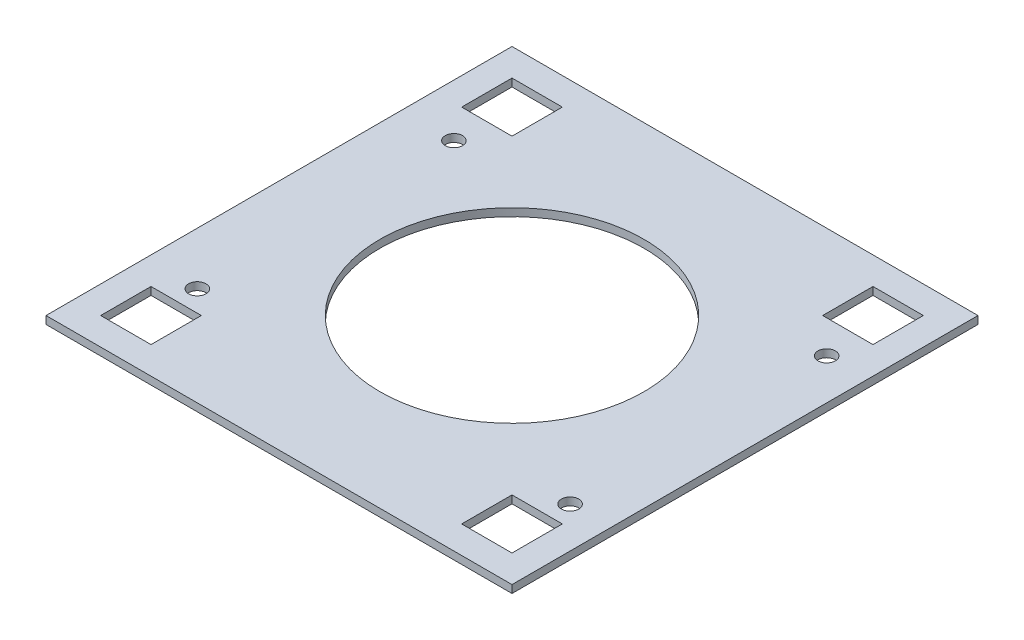
ISO-10303-21;
HEADER;
FILE_DESCRIPTION(('STEP AP214'),'2;1');
FILE_NAME('part.step','',(''),(''),'','','');
FILE_SCHEMA(('AUTOMOTIVE_DESIGN { 1 0 10303 214 1 1 1 1 }'));
ENDSEC;
DATA;
#1=APPLICATION_CONTEXT('core data for automotive mechanical design processes');
#2=APPLICATION_PROTOCOL_DEFINITION('international standard','automotive_design',2000,#1);
#3=PRODUCT_CONTEXT('',#1,'mechanical');
#4=PRODUCT('Part','Part','',(#3));
#5=PRODUCT_RELATED_PRODUCT_CATEGORY('part','',(#4));
#6=PRODUCT_DEFINITION_FORMATION('','',#4);
#7=PRODUCT_DEFINITION_CONTEXT('part definition',#1,'design');
#8=PRODUCT_DEFINITION('design','',#6,#7);
#9=PRODUCT_DEFINITION_SHAPE('','',#8);
#10=(LENGTH_UNIT() NAMED_UNIT(*) SI_UNIT(.MILLI.,.METRE.));
#11=(NAMED_UNIT(*) PLANE_ANGLE_UNIT() SI_UNIT($,.RADIAN.));
#12=(NAMED_UNIT(*) SI_UNIT($,.STERADIAN.) SOLID_ANGLE_UNIT());
#13=UNCERTAINTY_MEASURE_WITH_UNIT(LENGTH_MEASURE(1.E-05),#10,'distance_accuracy_value','');
#14=(GEOMETRIC_REPRESENTATION_CONTEXT(3) GLOBAL_UNCERTAINTY_ASSIGNED_CONTEXT((#13)) GLOBAL_UNIT_ASSIGNED_CONTEXT((#10,
#11,#12)) REPRESENTATION_CONTEXT('',''));
#15=CARTESIAN_POINT('',(0.,0.,0.));
#16=DIRECTION('',(0.,0.,1.));
#17=DIRECTION('',(1.,0.,0.));
#18=AXIS2_PLACEMENT_3D('',#15,#16,#17);
#19=CARTESIAN_POINT('',(0.,6.35,0.));
#20=DIRECTION('',(0.,1.,0.));
#21=DIRECTION('',(0.,0.,1.));
#22=AXIS2_PLACEMENT_3D('',#19,#20,#21);
#23=PLANE('',#22);
#24=CARTESIAN_POINT('',(157.226,6.35,109.728));
#25=DIRECTION('',(0.,1.,0.));
#26=DIRECTION('',(0.,0.,1.));
#27=AXIS2_PLACEMENT_3D('',#24,#25,#26);
#28=CIRCLE('',#27,7.112);
#29=CARTESIAN_POINT('',(157.226,6.35,116.84));
#30=VERTEX_POINT('',#29);
#31=EDGE_CURVE('E495',#30,#30,#28,.T.);
#32=ORIENTED_EDGE('',*,*,#31,.F.);
#33=EDGE_LOOP('',(#32));
#34=FACE_BOUND('',#33,.T.);
#35=CARTESIAN_POINT('',(-147.574,6.35,-100.076));
#36=DIRECTION('',(0.,1.,0.));
#37=DIRECTION('',(0.,0.,1.));
#38=AXIS2_PLACEMENT_3D('',#35,#36,#37);
#39=CIRCLE('',#38,7.112);
#40=CARTESIAN_POINT('',(-147.574,6.35,-92.964));
#41=VERTEX_POINT('',#40);
#42=EDGE_CURVE('E487',#41,#41,#39,.T.);
#43=ORIENTED_EDGE('',*,*,#42,.F.);
#44=EDGE_LOOP('',(#43));
#45=FACE_BOUND('',#44,.T.);
#46=CARTESIAN_POINT('',(-147.574,6.35,109.728));
#47=DIRECTION('',(0.,1.,0.));
#48=DIRECTION('',(0.,0.,1.));
#49=AXIS2_PLACEMENT_3D('',#46,#47,#48);
#50=CIRCLE('',#49,7.11199999999997);
#51=CARTESIAN_POINT('',(-147.574,6.35,116.84));
#52=VERTEX_POINT('',#51);
#53=EDGE_CURVE('E483',#52,#52,#50,.T.);
#54=ORIENTED_EDGE('',*,*,#53,.F.);
#55=EDGE_LOOP('',(#54));
#56=FACE_BOUND('',#55,.T.);
#57=CARTESIAN_POINT('',(157.226,6.35,-100.076));
#58=DIRECTION('',(0.,1.,0.));
#59=DIRECTION('',(0.,0.,1.));
#60=AXIS2_PLACEMENT_3D('',#57,#58,#59);
#61=CIRCLE('',#60,7.112);
#62=CARTESIAN_POINT('',(157.226,6.35,-92.964));
#63=VERTEX_POINT('',#62);
#64=EDGE_CURVE('E204',#63,#63,#61,.T.);
#65=ORIENTED_EDGE('',*,*,#64,.F.);
#66=EDGE_LOOP('',(#65));
#67=FACE_BOUND('',#66,.T.);
#68=DIRECTION('',(-1.,0.,0.));
#69=VECTOR('',#68,1.);
#70=CARTESIAN_POINT('',(0.,6.35,127.));
#71=LINE('',#70,#69);
#72=CARTESIAN_POINT('',(-127.,6.35,127.));
#73=VERTEX_POINT('',#72);
#74=CARTESIAN_POINT('',(-168.148,6.35,127.));
#75=VERTEX_POINT('',#74);
#76=EDGE_CURVE('E52',#73,#75,#71,.T.);
#77=ORIENTED_EDGE('',*,*,#76,.F.);
#78=DIRECTION('',(0.,0.,1.));
#79=VECTOR('',#78,1.);
#80=CARTESIAN_POINT('',(-127.,6.35,0.));
#81=LINE('',#80,#79);
#82=CARTESIAN_POINT('',(-127.,6.35,168.148));
#83=VERTEX_POINT('',#82);
#84=EDGE_CURVE('E254',#73,#83,#81,.T.);
#85=ORIENTED_EDGE('',*,*,#84,.T.);
#86=DIRECTION('',(-1.,0.,0.));
#87=VECTOR('',#86,1.);
#88=CARTESIAN_POINT('',(0.,6.35,168.148));
#89=LINE('',#88,#87);
#90=CARTESIAN_POINT('',(-168.148,6.35,168.148));
#91=VERTEX_POINT('',#90);
#92=EDGE_CURVE('E268',#83,#91,#89,.T.);
#93=ORIENTED_EDGE('',*,*,#92,.T.);
#94=DIRECTION('',(0.,0.,1.));
#95=VECTOR('',#94,1.);
#96=CARTESIAN_POINT('',(-168.148,6.35,0.));
#97=LINE('',#96,#95);
#98=EDGE_CURVE('E264',#75,#91,#97,.T.);
#99=ORIENTED_EDGE('',*,*,#98,.F.);
#100=EDGE_LOOP('',(#77,#85,#93,#99));
#101=FACE_BOUND('',#100,.T.);
#102=DIRECTION('',(0.,0.,1.));
#103=VECTOR('',#102,1.);
#104=CARTESIAN_POINT('',(127.,6.35,0.));
#105=LINE('',#104,#103);
#106=CARTESIAN_POINT('',(127.,6.35,127.));
#107=VERTEX_POINT('',#106);
#108=CARTESIAN_POINT('',(127.,6.35,168.148));
#109=VERTEX_POINT('',#108);
#110=EDGE_CURVE('E60',#107,#109,#105,.T.);
#111=ORIENTED_EDGE('',*,*,#110,.F.);
#112=DIRECTION('',(1.,0.,0.));
#113=VECTOR('',#112,1.);
#114=CARTESIAN_POINT('',(0.,6.35,127.));
#115=LINE('',#114,#113);
#116=CARTESIAN_POINT('',(168.148,6.35,127.));
#117=VERTEX_POINT('',#116);
#118=EDGE_CURVE('E225',#107,#117,#115,.T.);
#119=ORIENTED_EDGE('',*,*,#118,.T.);
#120=DIRECTION('',(0.,0.,1.));
#121=VECTOR('',#120,1.);
#122=CARTESIAN_POINT('',(168.148,6.35,0.));
#123=LINE('',#122,#121);
#124=CARTESIAN_POINT('',(168.148,6.35,168.148));
#125=VERTEX_POINT('',#124);
#126=EDGE_CURVE('E239',#117,#125,#123,.T.);
#127=ORIENTED_EDGE('',*,*,#126,.T.);
#128=DIRECTION('',(1.,0.,0.));
#129=VECTOR('',#128,1.);
#130=CARTESIAN_POINT('',(0.,6.35,168.148));
#131=LINE('',#130,#129);
#132=EDGE_CURVE('E235',#109,#125,#131,.T.);
#133=ORIENTED_EDGE('',*,*,#132,.F.);
#134=EDGE_LOOP('',(#111,#119,#127,#133));
#135=FACE_BOUND('',#134,.T.);
#136=DIRECTION('',(1.,0.,0.));
#137=VECTOR('',#136,1.);
#138=CARTESIAN_POINT('',(0.,6.35,-127.));
#139=LINE('',#138,#137);
#140=CARTESIAN_POINT('',(127.,6.35,-127.));
#141=VERTEX_POINT('',#140);
#142=CARTESIAN_POINT('',(168.148,6.35,-127.));
#143=VERTEX_POINT('',#142);
#144=EDGE_CURVE('E181',#141,#143,#139,.T.);
#145=ORIENTED_EDGE('',*,*,#144,.F.);
#146=DIRECTION('',(0.,0.,-1.));
#147=VECTOR('',#146,1.);
#148=CARTESIAN_POINT('',(127.,6.35,0.));
#149=LINE('',#148,#147);
#150=CARTESIAN_POINT('',(127.,6.35,-168.148));
#151=VERTEX_POINT('',#150);
#152=EDGE_CURVE('E198',#141,#151,#149,.T.);
#153=ORIENTED_EDGE('',*,*,#152,.T.);
#154=DIRECTION('',(1.,0.,0.));
#155=VECTOR('',#154,1.);
#156=CARTESIAN_POINT('',(0.,6.35,-168.148));
#157=LINE('',#156,#155);
#158=CARTESIAN_POINT('',(168.148,6.35,-168.148));
#159=VERTEX_POINT('',#158);
#160=EDGE_CURVE('E201',#151,#159,#157,.T.);
#161=ORIENTED_EDGE('',*,*,#160,.T.);
#162=DIRECTION('',(0.,0.,-1.));
#163=VECTOR('',#162,1.);
#164=CARTESIAN_POINT('',(168.148,6.35,0.));
#165=LINE('',#164,#163);
#166=EDGE_CURVE('E210',#143,#159,#165,.T.);
#167=ORIENTED_EDGE('',*,*,#166,.F.);
#168=EDGE_LOOP('',(#145,#153,#161,#167));
#169=FACE_BOUND('',#168,.T.);
#170=CARTESIAN_POINT('',(0.,6.35,0.));
#171=DIRECTION('',(0.,1.,0.));
#172=DIRECTION('',(0.,0.,1.));
#173=AXIS2_PLACEMENT_3D('',#170,#171,#172);
#174=CIRCLE('',#173,107.95);
#175=CARTESIAN_POINT('',(0.,6.35,107.95));
#176=VERTEX_POINT('',#175);
#177=EDGE_CURVE('E303',#176,#176,#174,.T.);
#178=ORIENTED_EDGE('',*,*,#177,.F.);
#179=EDGE_LOOP('',(#178));
#180=FACE_BOUND('',#179,.T.);
#181=DIRECTION('',(0.,0.,-1.));
#182=VECTOR('',#181,1.);
#183=CARTESIAN_POINT('',(190.5,6.35,-190.5));
#184=LINE('',#183,#182);
#185=CARTESIAN_POINT('',(190.5,6.35,190.5));
#186=VERTEX_POINT('',#185);
#187=CARTESIAN_POINT('',(190.5,6.35,-190.5));
#188=VERTEX_POINT('',#187);
#189=EDGE_CURVE('E316',#186,#188,#184,.T.);
#190=ORIENTED_EDGE('',*,*,#189,.T.);
#191=DIRECTION('',(-1.,0.,0.));
#192=VECTOR('',#191,1.);
#193=CARTESIAN_POINT('',(-190.5,6.35,-190.5));
#194=LINE('',#193,#192);
#195=CARTESIAN_POINT('',(-190.5,6.35,-190.5));
#196=VERTEX_POINT('',#195);
#197=EDGE_CURVE('E319',#188,#196,#194,.T.);
#198=ORIENTED_EDGE('',*,*,#197,.T.);
#199=DIRECTION('',(0.,0.,1.));
#200=VECTOR('',#199,1.);
#201=CARTESIAN_POINT('',(-190.5,6.35,-190.5));
#202=LINE('',#201,#200);
#203=CARTESIAN_POINT('',(-190.5,6.35,190.5));
#204=VERTEX_POINT('',#203);
#205=EDGE_CURVE('E322',#196,#204,#202,.T.);
#206=ORIENTED_EDGE('',*,*,#205,.T.);
#207=DIRECTION('',(1.,0.,0.));
#208=VECTOR('',#207,1.);
#209=CARTESIAN_POINT('',(-190.5,6.35,190.5));
#210=LINE('',#209,#208);
#211=EDGE_CURVE('E324',#204,#186,#210,.T.);
#212=ORIENTED_EDGE('',*,*,#211,.T.);
#213=EDGE_LOOP('',(#190,#198,#206,#212));
#214=FACE_BOUND('',#213,.T.);
#215=DIRECTION('',(-1.,0.,0.));
#216=VECTOR('',#215,1.);
#217=CARTESIAN_POINT('',(0.,6.35,-127.));
#218=LINE('',#217,#216);
#219=CARTESIAN_POINT('',(-127.,6.35,-127.));
#220=VERTEX_POINT('',#219);
#221=CARTESIAN_POINT('',(-168.148,6.35,-127.));
#222=VERTEX_POINT('',#221);
#223=EDGE_CURVE('E293',#220,#222,#218,.T.);
#224=ORIENTED_EDGE('',*,*,#223,.T.);
#225=DIRECTION('',(0.,0.,-1.));
#226=VECTOR('',#225,1.);
#227=CARTESIAN_POINT('',(-168.148,6.35,0.));
#228=LINE('',#227,#226);
#229=CARTESIAN_POINT('',(-168.148,6.35,-168.148));
#230=VERTEX_POINT('',#229);
#231=EDGE_CURVE('E217',#222,#230,#228,.T.);
#232=ORIENTED_EDGE('',*,*,#231,.T.);
#233=DIRECTION('',(-1.,0.,0.));
#234=VECTOR('',#233,1.);
#235=CARTESIAN_POINT('',(0.,6.35,-168.148));
#236=LINE('',#235,#234);
#237=CARTESIAN_POINT('',(-127.,6.35,-168.148));
#238=VERTEX_POINT('',#237);
#239=EDGE_CURVE('E282',#238,#230,#236,.T.);
#240=ORIENTED_EDGE('',*,*,#239,.F.);
#241=DIRECTION('',(0.,0.,-1.));
#242=VECTOR('',#241,1.);
#243=CARTESIAN_POINT('',(-127.,6.35,0.));
#244=LINE('',#243,#242);
#245=EDGE_CURVE('E296',#220,#238,#244,.T.);
#246=ORIENTED_EDGE('',*,*,#245,.F.);
#247=EDGE_LOOP('',(#224,#232,#240,#246));
#248=FACE_BOUND('',#247,.T.);
#249=ADVANCED_FACE('F37',(#34,#45,#56,#67,#101,#135,#169,#180,#214,#248),#23,.T.);
#250=CARTESIAN_POINT('',(0.,0.,0.));
#251=DIRECTION('',(0.,1.,0.));
#252=DIRECTION('',(0.,0.,1.));
#253=AXIS2_PLACEMENT_3D('',#250,#251,#252);
#254=PLANE('',#253);
#255=CARTESIAN_POINT('',(157.226,0.,109.728));
#256=DIRECTION('',(0.,1.,0.));
#257=DIRECTION('',(0.,0.,1.));
#258=AXIS2_PLACEMENT_3D('',#255,#256,#257);
#259=CIRCLE('',#258,7.112);
#260=CARTESIAN_POINT('',(157.226,0.,116.84));
#261=VERTEX_POINT('',#260);
#262=EDGE_CURVE('E498',#261,#261,#259,.T.);
#263=ORIENTED_EDGE('',*,*,#262,.T.);
#264=EDGE_LOOP('',(#263));
#265=FACE_BOUND('',#264,.T.);
#266=CARTESIAN_POINT('',(-147.574,0.,-100.076));
#267=DIRECTION('',(0.,1.,0.));
#268=DIRECTION('',(0.,0.,1.));
#269=AXIS2_PLACEMENT_3D('',#266,#267,#268);
#270=CIRCLE('',#269,7.112);
#271=CARTESIAN_POINT('',(-147.574,0.,-92.964));
#272=VERTEX_POINT('',#271);
#273=EDGE_CURVE('E492',#272,#272,#270,.T.);
#274=ORIENTED_EDGE('',*,*,#273,.T.);
#275=EDGE_LOOP('',(#274));
#276=FACE_BOUND('',#275,.T.);
#277=CARTESIAN_POINT('',(-147.574,0.,109.728));
#278=DIRECTION('',(0.,1.,0.));
#279=DIRECTION('',(0.,0.,1.));
#280=AXIS2_PLACEMENT_3D('',#277,#278,#279);
#281=CIRCLE('',#280,7.11199999999997);
#282=CARTESIAN_POINT('',(-147.574,0.,116.84));
#283=VERTEX_POINT('',#282);
#284=EDGE_CURVE('E480',#283,#283,#281,.T.);
#285=ORIENTED_EDGE('',*,*,#284,.T.);
#286=EDGE_LOOP('',(#285));
#287=FACE_BOUND('',#286,.T.);
#288=CARTESIAN_POINT('',(157.226,0.,-100.076));
#289=DIRECTION('',(0.,1.,0.));
#290=DIRECTION('',(0.,0.,1.));
#291=AXIS2_PLACEMENT_3D('',#288,#289,#290);
#292=CIRCLE('',#291,7.112);
#293=CARTESIAN_POINT('',(157.226,0.,-92.964));
#294=VERTEX_POINT('',#293);
#295=EDGE_CURVE('E265',#294,#294,#292,.T.);
#296=ORIENTED_EDGE('',*,*,#295,.T.);
#297=EDGE_LOOP('',(#296));
#298=FACE_BOUND('',#297,.T.);
#299=DIRECTION('',(0.,0.,1.));
#300=VECTOR('',#299,1.);
#301=CARTESIAN_POINT('',(-127.,0.,0.));
#302=LINE('',#301,#300);
#303=CARTESIAN_POINT('',(-127.,0.,127.));
#304=VERTEX_POINT('',#303);
#305=CARTESIAN_POINT('',(-127.,0.,168.148));
#306=VERTEX_POINT('',#305);
#307=EDGE_CURVE('E260',#304,#306,#302,.T.);
#308=ORIENTED_EDGE('',*,*,#307,.F.);
#309=DIRECTION('',(-1.,0.,0.));
#310=VECTOR('',#309,1.);
#311=CARTESIAN_POINT('',(0.,0.,127.));
#312=LINE('',#311,#310);
#313=CARTESIAN_POINT('',(-168.148,0.,127.));
#314=VERTEX_POINT('',#313);
#315=EDGE_CURVE('E250',#304,#314,#312,.T.);
#316=ORIENTED_EDGE('',*,*,#315,.T.);
#317=DIRECTION('',(0.,0.,1.));
#318=VECTOR('',#317,1.);
#319=CARTESIAN_POINT('',(-168.148,0.,0.));
#320=LINE('',#319,#318);
#321=CARTESIAN_POINT('',(-168.148,0.,168.148));
#322=VERTEX_POINT('',#321);
#323=EDGE_CURVE('E253',#314,#322,#320,.T.);
#324=ORIENTED_EDGE('',*,*,#323,.T.);
#325=DIRECTION('',(-1.,0.,0.));
#326=VECTOR('',#325,1.);
#327=CARTESIAN_POINT('',(0.,0.,168.148));
#328=LINE('',#327,#326);
#329=EDGE_CURVE('E257',#306,#322,#328,.T.);
#330=ORIENTED_EDGE('',*,*,#329,.F.);
#331=EDGE_LOOP('',(#308,#316,#324,#330));
#332=FACE_BOUND('',#331,.T.);
#333=DIRECTION('',(1.,0.,0.));
#334=VECTOR('',#333,1.);
#335=CARTESIAN_POINT('',(0.,0.,127.));
#336=LINE('',#335,#334);
#337=CARTESIAN_POINT('',(127.,0.,127.));
#338=VERTEX_POINT('',#337);
#339=CARTESIAN_POINT('',(168.148,0.,127.));
#340=VERTEX_POINT('',#339);
#341=EDGE_CURVE('E231',#338,#340,#336,.T.);
#342=ORIENTED_EDGE('',*,*,#341,.F.);
#343=DIRECTION('',(0.,0.,1.));
#344=VECTOR('',#343,1.);
#345=CARTESIAN_POINT('',(127.,0.,0.));
#346=LINE('',#345,#344);
#347=CARTESIAN_POINT('',(127.,0.,168.148));
#348=VERTEX_POINT('',#347);
#349=EDGE_CURVE('E221',#338,#348,#346,.T.);
#350=ORIENTED_EDGE('',*,*,#349,.T.);
#351=DIRECTION('',(1.,0.,0.));
#352=VECTOR('',#351,1.);
#353=CARTESIAN_POINT('',(0.,0.,168.148));
#354=LINE('',#353,#352);
#355=CARTESIAN_POINT('',(168.148,0.,168.148));
#356=VERTEX_POINT('',#355);
#357=EDGE_CURVE('E224',#348,#356,#354,.T.);
#358=ORIENTED_EDGE('',*,*,#357,.T.);
#359=DIRECTION('',(0.,0.,1.));
#360=VECTOR('',#359,1.);
#361=CARTESIAN_POINT('',(168.148,0.,0.));
#362=LINE('',#361,#360);
#363=EDGE_CURVE('E228',#340,#356,#362,.T.);
#364=ORIENTED_EDGE('',*,*,#363,.F.);
#365=EDGE_LOOP('',(#342,#350,#358,#364));
#366=FACE_BOUND('',#365,.T.);
#367=DIRECTION('',(0.,0.,-1.));
#368=VECTOR('',#367,1.);
#369=CARTESIAN_POINT('',(127.,0.,0.));
#370=LINE('',#369,#368);
#371=CARTESIAN_POINT('',(127.,0.,-127.));
#372=VERTEX_POINT('',#371);
#373=CARTESIAN_POINT('',(127.,0.,-168.148));
#374=VERTEX_POINT('',#373);
#375=EDGE_CURVE('E186',#372,#374,#370,.T.);
#376=ORIENTED_EDGE('',*,*,#375,.F.);
#377=DIRECTION('',(1.,0.,0.));
#378=VECTOR('',#377,1.);
#379=CARTESIAN_POINT('',(0.,0.,-127.));
#380=LINE('',#379,#378);
#381=CARTESIAN_POINT('',(168.148,0.,-127.));
#382=VERTEX_POINT('',#381);
#383=EDGE_CURVE('E178',#372,#382,#380,.T.);
#384=ORIENTED_EDGE('',*,*,#383,.T.);
#385=DIRECTION('',(0.,0.,-1.));
#386=VECTOR('',#385,1.);
#387=CARTESIAN_POINT('',(168.148,0.,0.));
#388=LINE('',#387,#386);
#389=CARTESIAN_POINT('',(168.148,0.,-168.148));
#390=VERTEX_POINT('',#389);
#391=EDGE_CURVE('E189',#382,#390,#388,.T.);
#392=ORIENTED_EDGE('',*,*,#391,.T.);
#393=DIRECTION('',(1.,0.,0.));
#394=VECTOR('',#393,1.);
#395=CARTESIAN_POINT('',(0.,0.,-168.148));
#396=LINE('',#395,#394);
#397=EDGE_CURVE('E194',#374,#390,#396,.T.);
#398=ORIENTED_EDGE('',*,*,#397,.F.);
#399=EDGE_LOOP('',(#376,#384,#392,#398));
#400=FACE_BOUND('',#399,.T.);
#401=DIRECTION('',(0.,0.,-1.));
#402=VECTOR('',#401,1.);
#403=CARTESIAN_POINT('',(190.5,0.,-190.5));
#404=LINE('',#403,#402);
#405=CARTESIAN_POINT('',(190.5,0.,190.5));
#406=VERTEX_POINT('',#405);
#407=CARTESIAN_POINT('',(190.5,0.,-190.5));
#408=VERTEX_POINT('',#407);
#409=EDGE_CURVE('E313',#406,#408,#404,.T.);
#410=ORIENTED_EDGE('',*,*,#409,.F.);
#411=DIRECTION('',(1.,0.,0.));
#412=VECTOR('',#411,1.);
#413=CARTESIAN_POINT('',(-190.5,0.,190.5));
#414=LINE('',#413,#412);
#415=CARTESIAN_POINT('',(-190.5,0.,190.5));
#416=VERTEX_POINT('',#415);
#417=EDGE_CURVE('E320',#416,#406,#414,.T.);
#418=ORIENTED_EDGE('',*,*,#417,.F.);
#419=DIRECTION('',(0.,0.,1.));
#420=VECTOR('',#419,1.);
#421=CARTESIAN_POINT('',(-190.5,0.,-190.5));
#422=LINE('',#421,#420);
#423=CARTESIAN_POINT('',(-190.5,0.,-190.5));
#424=VERTEX_POINT('',#423);
#425=EDGE_CURVE('E331',#424,#416,#422,.T.);
#426=ORIENTED_EDGE('',*,*,#425,.F.);
#427=DIRECTION('',(-1.,0.,0.));
#428=VECTOR('',#427,1.);
#429=CARTESIAN_POINT('',(-190.5,0.,-190.5));
#430=LINE('',#429,#428);
#431=EDGE_CURVE('E329',#408,#424,#430,.T.);
#432=ORIENTED_EDGE('',*,*,#431,.F.);
#433=EDGE_LOOP('',(#410,#418,#426,#432));
#434=FACE_BOUND('',#433,.T.);
#435=CARTESIAN_POINT('',(0.,0.,0.));
#436=DIRECTION('',(0.,1.,0.));
#437=DIRECTION('',(0.,0.,1.));
#438=AXIS2_PLACEMENT_3D('',#435,#436,#437);
#439=CIRCLE('',#438,107.95);
#440=CARTESIAN_POINT('',(0.,0.,107.95));
#441=VERTEX_POINT('',#440);
#442=EDGE_CURVE('E310',#441,#441,#439,.T.);
#443=ORIENTED_EDGE('',*,*,#442,.T.);
#444=EDGE_LOOP('',(#443));
#445=FACE_BOUND('',#444,.T.);
#446=DIRECTION('',(0.,0.,-1.));
#447=VECTOR('',#446,1.);
#448=CARTESIAN_POINT('',(-168.148,0.,0.));
#449=LINE('',#448,#447);
#450=CARTESIAN_POINT('',(-168.148,0.,-127.));
#451=VERTEX_POINT('',#450);
#452=CARTESIAN_POINT('',(-168.148,0.,-168.148));
#453=VERTEX_POINT('',#452);
#454=EDGE_CURVE('E279',#451,#453,#449,.T.);
#455=ORIENTED_EDGE('',*,*,#454,.F.);
#456=DIRECTION('',(-1.,0.,0.));
#457=VECTOR('',#456,1.);
#458=CARTESIAN_POINT('',(0.,0.,-127.));
#459=LINE('',#458,#457);
#460=CARTESIAN_POINT('',(-127.,0.,-127.));
#461=VERTEX_POINT('',#460);
#462=EDGE_CURVE('E281',#461,#451,#459,.T.);
#463=ORIENTED_EDGE('',*,*,#462,.F.);
#464=DIRECTION('',(0.,0.,-1.));
#465=VECTOR('',#464,1.);
#466=CARTESIAN_POINT('',(-127.,0.,0.));
#467=LINE('',#466,#465);
#468=CARTESIAN_POINT('',(-127.,0.,-168.148));
#469=VERTEX_POINT('',#468);
#470=EDGE_CURVE('E284',#461,#469,#467,.T.);
#471=ORIENTED_EDGE('',*,*,#470,.T.);
#472=DIRECTION('',(-1.,0.,0.));
#473=VECTOR('',#472,1.);
#474=CARTESIAN_POINT('',(0.,0.,-168.148));
#475=LINE('',#474,#473);
#476=EDGE_CURVE('E287',#469,#453,#475,.T.);
#477=ORIENTED_EDGE('',*,*,#476,.T.);
#478=EDGE_LOOP('',(#455,#463,#471,#477));
#479=FACE_BOUND('',#478,.T.);
#480=ADVANCED_FACE('F196',(#265,#276,#287,#298,#332,#366,#400,#434,#445,#479),#254,.F.);
#481=CARTESIAN_POINT('',(190.5,6.35,-190.5));
#482=DIRECTION('',(-1.,0.,0.));
#483=DIRECTION('',(0.,0.,1.));
#484=AXIS2_PLACEMENT_3D('',#481,#482,#483);
#485=PLANE('',#484);
#486=ORIENTED_EDGE('',*,*,#409,.T.);
#487=DIRECTION('',(0.,-1.,0.));
#488=VECTOR('',#487,1.);
#489=CARTESIAN_POINT('',(190.5,6.35,-190.5));
#490=LINE('',#489,#488);
#491=EDGE_CURVE('E11',#188,#408,#490,.T.);
#492=ORIENTED_EDGE('',*,*,#491,.F.);
#493=ORIENTED_EDGE('',*,*,#189,.F.);
#494=DIRECTION('',(0.,-1.,0.));
#495=VECTOR('',#494,1.);
#496=CARTESIAN_POINT('',(190.5,6.35,190.5));
#497=LINE('',#496,#495);
#498=EDGE_CURVE('E326',#186,#406,#497,.T.);
#499=ORIENTED_EDGE('',*,*,#498,.T.);
#500=EDGE_LOOP('',(#486,#492,#493,#499));
#501=FACE_BOUND('',#500,.T.);
#502=ADVANCED_FACE('F39',(#501),#485,.F.);
#503=CARTESIAN_POINT('',(-190.5,6.35,-190.5));
#504=DIRECTION('',(0.,0.,1.));
#505=DIRECTION('',(1.,0.,0.));
#506=AXIS2_PLACEMENT_3D('',#503,#504,#505);
#507=PLANE('',#506);
#508=ORIENTED_EDGE('',*,*,#431,.T.);
#509=DIRECTION('',(0.,-1.,0.));
#510=VECTOR('',#509,1.);
#511=CARTESIAN_POINT('',(-190.5,6.35,-190.5));
#512=LINE('',#511,#510);
#513=EDGE_CURVE('E45',#196,#424,#512,.T.);
#514=ORIENTED_EDGE('',*,*,#513,.F.);
#515=ORIENTED_EDGE('',*,*,#197,.F.);
#516=ORIENTED_EDGE('',*,*,#491,.T.);
#517=EDGE_LOOP('',(#508,#514,#515,#516));
#518=FACE_BOUND('',#517,.T.);
#519=ADVANCED_FACE('F358',(#518),#507,.F.);
#520=CARTESIAN_POINT('',(-190.5,6.35,-190.5));
#521=DIRECTION('',(1.,0.,0.));
#522=DIRECTION('',(0.,0.,-1.));
#523=AXIS2_PLACEMENT_3D('',#520,#521,#522);
#524=PLANE('',#523);
#525=ORIENTED_EDGE('',*,*,#425,.T.);
#526=DIRECTION('',(0.,-1.,0.));
#527=VECTOR('',#526,1.);
#528=CARTESIAN_POINT('',(-190.5,6.35,190.5));
#529=LINE('',#528,#527);
#530=EDGE_CURVE('E336',#204,#416,#529,.T.);
#531=ORIENTED_EDGE('',*,*,#530,.F.);
#532=ORIENTED_EDGE('',*,*,#205,.F.);
#533=ORIENTED_EDGE('',*,*,#513,.T.);
#534=EDGE_LOOP('',(#525,#531,#532,#533));
#535=FACE_BOUND('',#534,.T.);
#536=ADVANCED_FACE('F343',(#535),#524,.F.);
#537=CARTESIAN_POINT('',(-190.5,6.35,190.5));
#538=DIRECTION('',(0.,0.,-1.));
#539=DIRECTION('',(-1.,0.,0.));
#540=AXIS2_PLACEMENT_3D('',#537,#538,#539);
#541=PLANE('',#540);
#542=ORIENTED_EDGE('',*,*,#417,.T.);
#543=ORIENTED_EDGE('',*,*,#498,.F.);
#544=ORIENTED_EDGE('',*,*,#211,.F.);
#545=ORIENTED_EDGE('',*,*,#530,.T.);
#546=EDGE_LOOP('',(#542,#543,#544,#545));
#547=FACE_BOUND('',#546,.T.);
#548=ADVANCED_FACE('F351',(#547),#541,.F.);
#549=CARTESIAN_POINT('',(0.,0.,0.));
#550=DIRECTION('',(0.,1.,0.));
#551=DIRECTION('',(0.,0.,1.));
#552=AXIS2_PLACEMENT_3D('',#549,#550,#551);
#553=CYLINDRICAL_SURFACE('',#552,107.95);
#554=ORIENTED_EDGE('',*,*,#442,.F.);
#555=EDGE_LOOP('',(#554));
#556=FACE_BOUND('',#555,.T.);
#557=ORIENTED_EDGE('',*,*,#177,.T.);
#558=EDGE_LOOP('',(#557));
#559=FACE_BOUND('',#558,.T.);
#560=ADVANCED_FACE('F376',(#556,#559),#553,.F.);
#561=CARTESIAN_POINT('',(-168.148,0.,0.));
#562=DIRECTION('',(1.,0.,0.));
#563=DIRECTION('',(0.,0.,-1.));
#564=AXIS2_PLACEMENT_3D('',#561,#562,#563);
#565=PLANE('',#564);
#566=ORIENTED_EDGE('',*,*,#231,.F.);
#567=DIRECTION('',(0.,1.,0.));
#568=VECTOR('',#567,1.);
#569=CARTESIAN_POINT('',(-168.148,0.,-127.));
#570=LINE('',#569,#568);
#571=EDGE_CURVE('E290',#451,#222,#570,.T.);
#572=ORIENTED_EDGE('',*,*,#571,.F.);
#573=ORIENTED_EDGE('',*,*,#454,.T.);
#574=DIRECTION('',(0.,1.,0.));
#575=VECTOR('',#574,1.);
#576=CARTESIAN_POINT('',(-168.148,0.,-168.148));
#577=LINE('',#576,#575);
#578=EDGE_CURVE('E301',#453,#230,#577,.T.);
#579=ORIENTED_EDGE('',*,*,#578,.T.);
#580=EDGE_LOOP('',(#566,#572,#573,#579));
#581=FACE_BOUND('',#580,.T.);
#582=ADVANCED_FACE('F383',(#581),#565,.T.);
#583=CARTESIAN_POINT('',(0.,0.,-168.148));
#584=DIRECTION('',(0.,0.,-1.));
#585=DIRECTION('',(-1.,0.,0.));
#586=AXIS2_PLACEMENT_3D('',#583,#584,#585);
#587=PLANE('',#586);
#588=ORIENTED_EDGE('',*,*,#239,.T.);
#589=ORIENTED_EDGE('',*,*,#578,.F.);
#590=ORIENTED_EDGE('',*,*,#476,.F.);
#591=DIRECTION('',(0.,1.,0.));
#592=VECTOR('',#591,1.);
#593=CARTESIAN_POINT('',(-127.,0.,-168.148));
#594=LINE('',#593,#592);
#595=EDGE_CURVE('E304',#469,#238,#594,.T.);
#596=ORIENTED_EDGE('',*,*,#595,.T.);
#597=EDGE_LOOP('',(#588,#589,#590,#596));
#598=FACE_BOUND('',#597,.T.);
#599=ADVANCED_FACE('F388',(#598),#587,.F.);
#600=CARTESIAN_POINT('',(-127.,0.,0.));
#601=DIRECTION('',(1.,0.,0.));
#602=DIRECTION('',(0.,0.,-1.));
#603=AXIS2_PLACEMENT_3D('',#600,#601,#602);
#604=PLANE('',#603);
#605=ORIENTED_EDGE('',*,*,#245,.T.);
#606=ORIENTED_EDGE('',*,*,#595,.F.);
#607=ORIENTED_EDGE('',*,*,#470,.F.);
#608=DIRECTION('',(0.,1.,0.));
#609=VECTOR('',#608,1.);
#610=CARTESIAN_POINT('',(-127.,0.,-127.));
#611=LINE('',#610,#609);
#612=EDGE_CURVE('E306',#461,#220,#611,.T.);
#613=ORIENTED_EDGE('',*,*,#612,.T.);
#614=EDGE_LOOP('',(#605,#606,#607,#613));
#615=FACE_BOUND('',#614,.T.);
#616=ADVANCED_FACE('F408',(#615),#604,.F.);
#617=CARTESIAN_POINT('',(0.,0.,-127.));
#618=DIRECTION('',(0.,0.,-1.));
#619=DIRECTION('',(-1.,0.,0.));
#620=AXIS2_PLACEMENT_3D('',#617,#618,#619);
#621=PLANE('',#620);
#622=ORIENTED_EDGE('',*,*,#223,.F.);
#623=ORIENTED_EDGE('',*,*,#612,.F.);
#624=ORIENTED_EDGE('',*,*,#462,.T.);
#625=ORIENTED_EDGE('',*,*,#571,.T.);
#626=EDGE_LOOP('',(#622,#623,#624,#625));
#627=FACE_BOUND('',#626,.T.);
#628=ADVANCED_FACE('F405',(#627),#621,.T.);
#629=CARTESIAN_POINT('',(0.,0.,-127.));
#630=DIRECTION('',(0.,0.,1.));
#631=DIRECTION('',(1.,0.,0.));
#632=AXIS2_PLACEMENT_3D('',#629,#630,#631);
#633=PLANE('',#632);
#634=ORIENTED_EDGE('',*,*,#144,.T.);
#635=DIRECTION('',(0.,1.,0.));
#636=VECTOR('',#635,1.);
#637=CARTESIAN_POINT('',(168.148,0.,-127.));
#638=LINE('',#637,#636);
#639=EDGE_CURVE('E174',#382,#143,#638,.T.);
#640=ORIENTED_EDGE('',*,*,#639,.F.);
#641=ORIENTED_EDGE('',*,*,#383,.F.);
#642=DIRECTION('',(0.,1.,0.));
#643=VECTOR('',#642,1.);
#644=CARTESIAN_POINT('',(127.,0.,-127.));
#645=LINE('',#644,#643);
#646=EDGE_CURVE('E215',#372,#141,#645,.T.);
#647=ORIENTED_EDGE('',*,*,#646,.T.);
#648=EDGE_LOOP('',(#634,#640,#641,#647));
#649=FACE_BOUND('',#648,.T.);
#650=ADVANCED_FACE('F176',(#649),#633,.F.);
#651=CARTESIAN_POINT('',(127.,0.,0.));
#652=DIRECTION('',(1.,0.,0.));
#653=DIRECTION('',(0.,0.,-1.));
#654=AXIS2_PLACEMENT_3D('',#651,#652,#653);
#655=PLANE('',#654);
#656=ORIENTED_EDGE('',*,*,#152,.F.);
#657=ORIENTED_EDGE('',*,*,#646,.F.);
#658=ORIENTED_EDGE('',*,*,#375,.T.);
#659=DIRECTION('',(0.,1.,0.));
#660=VECTOR('',#659,1.);
#661=CARTESIAN_POINT('',(127.,0.,-168.148));
#662=LINE('',#661,#660);
#663=EDGE_CURVE('E218',#374,#151,#662,.T.);
#664=ORIENTED_EDGE('',*,*,#663,.T.);
#665=EDGE_LOOP('',(#656,#657,#658,#664));
#666=FACE_BOUND('',#665,.T.);
#667=ADVANCED_FACE('F451',(#666),#655,.T.);
#668=CARTESIAN_POINT('',(0.,0.,-168.148));
#669=DIRECTION('',(0.,0.,1.));
#670=DIRECTION('',(1.,0.,0.));
#671=AXIS2_PLACEMENT_3D('',#668,#669,#670);
#672=PLANE('',#671);
#673=ORIENTED_EDGE('',*,*,#160,.F.);
#674=ORIENTED_EDGE('',*,*,#663,.F.);
#675=ORIENTED_EDGE('',*,*,#397,.T.);
#676=DIRECTION('',(0.,1.,0.));
#677=VECTOR('',#676,1.);
#678=CARTESIAN_POINT('',(168.148,0.,-168.148));
#679=LINE('',#678,#677);
#680=EDGE_CURVE('E185',#390,#159,#679,.T.);
#681=ORIENTED_EDGE('',*,*,#680,.T.);
#682=EDGE_LOOP('',(#673,#674,#675,#681));
#683=FACE_BOUND('',#682,.T.);
#684=ADVANCED_FACE('F454',(#683),#672,.T.);
#685=CARTESIAN_POINT('',(168.148,0.,0.));
#686=DIRECTION('',(1.,0.,0.));
#687=DIRECTION('',(0.,0.,-1.));
#688=AXIS2_PLACEMENT_3D('',#685,#686,#687);
#689=PLANE('',#688);
#690=ORIENTED_EDGE('',*,*,#166,.T.);
#691=ORIENTED_EDGE('',*,*,#680,.F.);
#692=ORIENTED_EDGE('',*,*,#391,.F.);
#693=ORIENTED_EDGE('',*,*,#639,.T.);
#694=EDGE_LOOP('',(#690,#691,#692,#693));
#695=FACE_BOUND('',#694,.T.);
#696=ADVANCED_FACE('F190',(#695),#689,.F.);
#697=CARTESIAN_POINT('',(127.,0.,0.));
#698=DIRECTION('',(-1.,0.,0.));
#699=DIRECTION('',(0.,0.,1.));
#700=AXIS2_PLACEMENT_3D('',#697,#698,#699);
#701=PLANE('',#700);
#702=ORIENTED_EDGE('',*,*,#110,.T.);
#703=DIRECTION('',(0.,1.,0.));
#704=VECTOR('',#703,1.);
#705=CARTESIAN_POINT('',(127.,0.,168.148));
#706=LINE('',#705,#704);
#707=EDGE_CURVE('E233',#348,#109,#706,.T.);
#708=ORIENTED_EDGE('',*,*,#707,.F.);
#709=ORIENTED_EDGE('',*,*,#349,.F.);
#710=DIRECTION('',(0.,1.,0.));
#711=VECTOR('',#710,1.);
#712=CARTESIAN_POINT('',(127.,0.,127.));
#713=LINE('',#712,#711);
#714=EDGE_CURVE('E211',#338,#107,#713,.T.);
#715=ORIENTED_EDGE('',*,*,#714,.T.);
#716=EDGE_LOOP('',(#702,#708,#709,#715));
#717=FACE_BOUND('',#716,.T.);
#718=ADVANCED_FACE('F435',(#717),#701,.F.);
#719=CARTESIAN_POINT('',(0.,0.,127.));
#720=DIRECTION('',(0.,0.,1.));
#721=DIRECTION('',(1.,0.,0.));
#722=AXIS2_PLACEMENT_3D('',#719,#720,#721);
#723=PLANE('',#722);
#724=ORIENTED_EDGE('',*,*,#118,.F.);
#725=ORIENTED_EDGE('',*,*,#714,.F.);
#726=ORIENTED_EDGE('',*,*,#341,.T.);
#727=DIRECTION('',(0.,1.,0.));
#728=VECTOR('',#727,1.);
#729=CARTESIAN_POINT('',(168.148,0.,127.));
#730=LINE('',#729,#728);
#731=EDGE_CURVE('E245',#340,#117,#730,.T.);
#732=ORIENTED_EDGE('',*,*,#731,.T.);
#733=EDGE_LOOP('',(#724,#725,#726,#732));
#734=FACE_BOUND('',#733,.T.);
#735=ADVANCED_FACE('F438',(#734),#723,.T.);
#736=CARTESIAN_POINT('',(168.148,0.,0.));
#737=DIRECTION('',(-1.,0.,0.));
#738=DIRECTION('',(0.,0.,1.));
#739=AXIS2_PLACEMENT_3D('',#736,#737,#738);
#740=PLANE('',#739);
#741=ORIENTED_EDGE('',*,*,#126,.F.);
#742=ORIENTED_EDGE('',*,*,#731,.F.);
#743=ORIENTED_EDGE('',*,*,#363,.T.);
#744=DIRECTION('',(0.,1.,0.));
#745=VECTOR('',#744,1.);
#746=CARTESIAN_POINT('',(168.148,0.,168.148));
#747=LINE('',#746,#745);
#748=EDGE_CURVE('E247',#356,#125,#747,.T.);
#749=ORIENTED_EDGE('',*,*,#748,.T.);
#750=EDGE_LOOP('',(#741,#742,#743,#749));
#751=FACE_BOUND('',#750,.T.);
#752=ADVANCED_FACE('F441',(#751),#740,.T.);
#753=CARTESIAN_POINT('',(0.,0.,168.148));
#754=DIRECTION('',(0.,0.,1.));
#755=DIRECTION('',(1.,0.,0.));
#756=AXIS2_PLACEMENT_3D('',#753,#754,#755);
#757=PLANE('',#756);
#758=ORIENTED_EDGE('',*,*,#132,.T.);
#759=ORIENTED_EDGE('',*,*,#748,.F.);
#760=ORIENTED_EDGE('',*,*,#357,.F.);
#761=ORIENTED_EDGE('',*,*,#707,.T.);
#762=EDGE_LOOP('',(#758,#759,#760,#761));
#763=FACE_BOUND('',#762,.T.);
#764=ADVANCED_FACE('F422',(#763),#757,.F.);
#765=CARTESIAN_POINT('',(0.,0.,127.));
#766=DIRECTION('',(0.,0.,-1.));
#767=DIRECTION('',(-1.,0.,0.));
#768=AXIS2_PLACEMENT_3D('',#765,#766,#767);
#769=PLANE('',#768);
#770=ORIENTED_EDGE('',*,*,#76,.T.);
#771=DIRECTION('',(0.,1.,0.));
#772=VECTOR('',#771,1.);
#773=CARTESIAN_POINT('',(-168.148,0.,127.));
#774=LINE('',#773,#772);
#775=EDGE_CURVE('E262',#314,#75,#774,.T.);
#776=ORIENTED_EDGE('',*,*,#775,.F.);
#777=ORIENTED_EDGE('',*,*,#315,.F.);
#778=DIRECTION('',(0.,1.,0.));
#779=VECTOR('',#778,1.);
#780=CARTESIAN_POINT('',(-127.,0.,127.));
#781=LINE('',#780,#779);
#782=EDGE_CURVE('E236',#304,#73,#781,.T.);
#783=ORIENTED_EDGE('',*,*,#782,.T.);
#784=EDGE_LOOP('',(#770,#776,#777,#783));
#785=FACE_BOUND('',#784,.T.);
#786=ADVANCED_FACE('F418',(#785),#769,.F.);
#787=CARTESIAN_POINT('',(-127.,0.,0.));
#788=DIRECTION('',(-1.,0.,0.));
#789=DIRECTION('',(0.,0.,1.));
#790=AXIS2_PLACEMENT_3D('',#787,#788,#789);
#791=PLANE('',#790);
#792=ORIENTED_EDGE('',*,*,#84,.F.);
#793=ORIENTED_EDGE('',*,*,#782,.F.);
#794=ORIENTED_EDGE('',*,*,#307,.T.);
#795=DIRECTION('',(0.,1.,0.));
#796=VECTOR('',#795,1.);
#797=CARTESIAN_POINT('',(-127.,0.,168.148));
#798=LINE('',#797,#796);
#799=EDGE_CURVE('E274',#306,#83,#798,.T.);
#800=ORIENTED_EDGE('',*,*,#799,.T.);
#801=EDGE_LOOP('',(#792,#793,#794,#800));
#802=FACE_BOUND('',#801,.T.);
#803=ADVANCED_FACE('F421',(#802),#791,.T.);
#804=CARTESIAN_POINT('',(0.,0.,168.148));
#805=DIRECTION('',(0.,0.,-1.));
#806=DIRECTION('',(-1.,0.,0.));
#807=AXIS2_PLACEMENT_3D('',#804,#805,#806);
#808=PLANE('',#807);
#809=ORIENTED_EDGE('',*,*,#92,.F.);
#810=ORIENTED_EDGE('',*,*,#799,.F.);
#811=ORIENTED_EDGE('',*,*,#329,.T.);
#812=DIRECTION('',(0.,1.,0.));
#813=VECTOR('',#812,1.);
#814=CARTESIAN_POINT('',(-168.148,0.,168.148));
#815=LINE('',#814,#813);
#816=EDGE_CURVE('E276',#322,#91,#815,.T.);
#817=ORIENTED_EDGE('',*,*,#816,.T.);
#818=EDGE_LOOP('',(#809,#810,#811,#817));
#819=FACE_BOUND('',#818,.T.);
#820=ADVANCED_FACE('F427',(#819),#808,.T.);
#821=CARTESIAN_POINT('',(-168.148,0.,0.));
#822=DIRECTION('',(-1.,0.,0.));
#823=DIRECTION('',(0.,0.,1.));
#824=AXIS2_PLACEMENT_3D('',#821,#822,#823);
#825=PLANE('',#824);
#826=ORIENTED_EDGE('',*,*,#98,.T.);
#827=ORIENTED_EDGE('',*,*,#816,.F.);
#828=ORIENTED_EDGE('',*,*,#323,.F.);
#829=ORIENTED_EDGE('',*,*,#775,.T.);
#830=EDGE_LOOP('',(#826,#827,#828,#829));
#831=FACE_BOUND('',#830,.T.);
#832=ADVANCED_FACE('F423',(#831),#825,.F.);
#833=CARTESIAN_POINT('',(157.226,0.,-100.076));
#834=DIRECTION('',(0.,1.,0.));
#835=DIRECTION('',(0.,0.,1.));
#836=AXIS2_PLACEMENT_3D('',#833,#834,#835);
#837=CYLINDRICAL_SURFACE('',#836,7.112);
#838=ORIENTED_EDGE('',*,*,#295,.F.);
#839=EDGE_LOOP('',(#838));
#840=FACE_BOUND('',#839,.T.);
#841=ORIENTED_EDGE('',*,*,#64,.T.);
#842=EDGE_LOOP('',(#841));
#843=FACE_BOUND('',#842,.T.);
#844=ADVANCED_FACE('F426',(#840,#843),#837,.F.);
#845=CARTESIAN_POINT('',(-147.574,0.,109.728));
#846=DIRECTION('',(0.,1.,0.));
#847=DIRECTION('',(0.,0.,1.));
#848=AXIS2_PLACEMENT_3D('',#845,#846,#847);
#849=CYLINDRICAL_SURFACE('',#848,7.11199999999997);
#850=ORIENTED_EDGE('',*,*,#284,.F.);
#851=EDGE_LOOP('',(#850));
#852=FACE_BOUND('',#851,.T.);
#853=ORIENTED_EDGE('',*,*,#53,.T.);
#854=EDGE_LOOP('',(#853));
#855=FACE_BOUND('',#854,.T.);
#856=ADVANCED_FACE('F463',(#852,#855),#849,.F.);
#857=CARTESIAN_POINT('',(-147.574,0.,-100.076));
#858=DIRECTION('',(0.,1.,0.));
#859=DIRECTION('',(0.,0.,1.));
#860=AXIS2_PLACEMENT_3D('',#857,#858,#859);
#861=CYLINDRICAL_SURFACE('',#860,7.112);
#862=ORIENTED_EDGE('',*,*,#273,.F.);
#863=EDGE_LOOP('',(#862));
#864=FACE_BOUND('',#863,.T.);
#865=ORIENTED_EDGE('',*,*,#42,.T.);
#866=EDGE_LOOP('',(#865));
#867=FACE_BOUND('',#866,.T.);
#868=ADVANCED_FACE('F468',(#864,#867),#861,.F.);
#869=CARTESIAN_POINT('',(157.226,0.,109.728));
#870=DIRECTION('',(0.,1.,0.));
#871=DIRECTION('',(0.,0.,1.));
#872=AXIS2_PLACEMENT_3D('',#869,#870,#871);
#873=CYLINDRICAL_SURFACE('',#872,7.112);
#874=ORIENTED_EDGE('',*,*,#262,.F.);
#875=EDGE_LOOP('',(#874));
#876=FACE_BOUND('',#875,.T.);
#877=ORIENTED_EDGE('',*,*,#31,.T.);
#878=EDGE_LOOP('',(#877));
#879=FACE_BOUND('',#878,.T.);
#880=ADVANCED_FACE('F465',(#876,#879),#873,.F.);
#881=CLOSED_SHELL('',(#249,#480,#502,#519,#536,#548,#560,#582,#599,#616,#628,#650,#667,#684,
#696,#718,#735,#752,#764,#786,#803,#820,#832,#844,#856,#868,#880));
#882=MANIFOLD_SOLID_BREP('B2',#881);
#883=ADVANCED_BREP_SHAPE_REPRESENTATION('',(#18,#882),#14);
#884=SHAPE_DEFINITION_REPRESENTATION(#9,#883);
ENDSEC;
END-ISO-10303-21;
